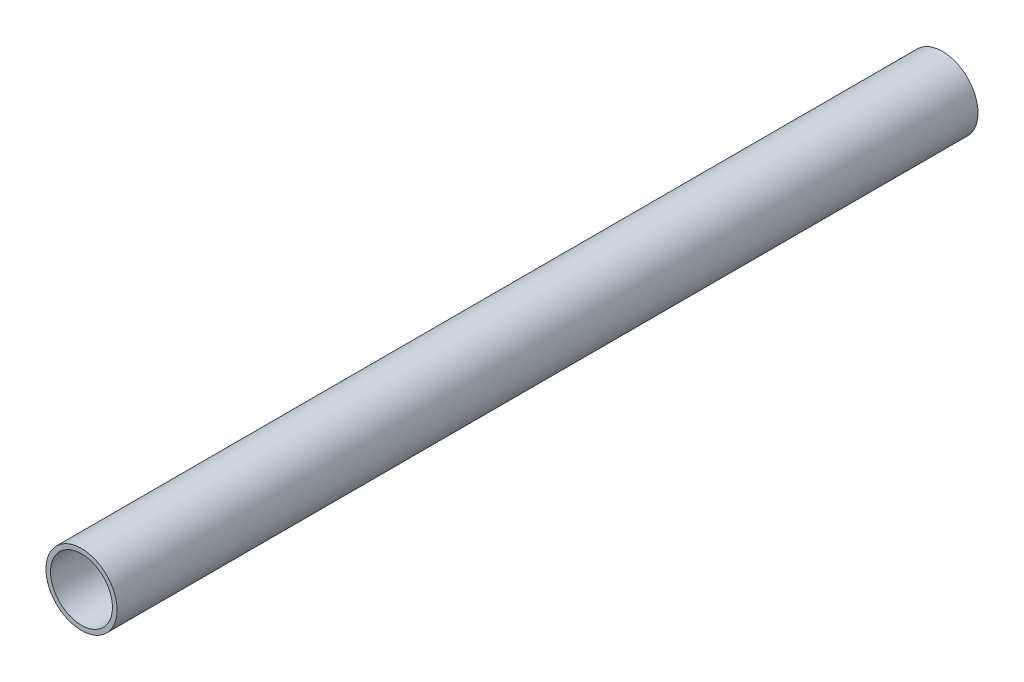
ISO-10303-21;
HEADER;
FILE_DESCRIPTION(('STEP AP214'),'2;1');
FILE_NAME('part.step','',(''),(''),'','','');
FILE_SCHEMA(('AUTOMOTIVE_DESIGN { 1 0 10303 214 1 1 1 1 }'));
ENDSEC;
DATA;
#1=APPLICATION_CONTEXT('core data for automotive mechanical design processes');
#2=APPLICATION_PROTOCOL_DEFINITION('international standard','automotive_design',2000,#1);
#3=PRODUCT_CONTEXT('',#1,'mechanical');
#4=PRODUCT('Part','Part','',(#3));
#5=PRODUCT_RELATED_PRODUCT_CATEGORY('part','',(#4));
#6=PRODUCT_DEFINITION_FORMATION('','',#4);
#7=PRODUCT_DEFINITION_CONTEXT('part definition',#1,'design');
#8=PRODUCT_DEFINITION('design','',#6,#7);
#9=PRODUCT_DEFINITION_SHAPE('','',#8);
#10=(LENGTH_UNIT() NAMED_UNIT(*) SI_UNIT(.MILLI.,.METRE.));
#11=(NAMED_UNIT(*) PLANE_ANGLE_UNIT() SI_UNIT($,.RADIAN.));
#12=(NAMED_UNIT(*) SI_UNIT($,.STERADIAN.) SOLID_ANGLE_UNIT());
#13=UNCERTAINTY_MEASURE_WITH_UNIT(LENGTH_MEASURE(1.E-05),#10,'distance_accuracy_value','');
#14=(GEOMETRIC_REPRESENTATION_CONTEXT(3) GLOBAL_UNCERTAINTY_ASSIGNED_CONTEXT((#13)) GLOBAL_UNIT_ASSIGNED_CONTEXT((#10,
#11,#12)) REPRESENTATION_CONTEXT('',''));
#15=CARTESIAN_POINT('',(0.,0.,0.));
#16=DIRECTION('',(0.,0.,1.));
#17=DIRECTION('',(1.,0.,0.));
#18=AXIS2_PLACEMENT_3D('',#15,#16,#17);
#19=CARTESIAN_POINT('',(0.,0.,730.25));
#20=DIRECTION('',(0.,0.,1.));
#21=DIRECTION('',(1.,0.,0.));
#22=AXIS2_PLACEMENT_3D('',#19,#20,#21);
#23=PLANE('',#22);
#24=CARTESIAN_POINT('',(0.,0.,730.25));
#25=DIRECTION('',(0.,0.,1.));
#26=DIRECTION('',(1.,0.,0.));
#27=AXIS2_PLACEMENT_3D('',#24,#25,#26);
#28=CIRCLE('',#27,30.1625);
#29=CARTESIAN_POINT('',(30.1625,0.,730.25));
#30=VERTEX_POINT('',#29);
#31=EDGE_CURVE('E12',#30,#30,#28,.T.);
#32=ORIENTED_EDGE('',*,*,#31,.T.);
#33=EDGE_LOOP('',(#32));
#34=FACE_BOUND('',#33,.T.);
#35=CARTESIAN_POINT('',(0.,0.,730.25));
#36=DIRECTION('',(0.,0.,1.));
#37=DIRECTION('',(1.,0.,0.));
#38=AXIS2_PLACEMENT_3D('',#35,#36,#37);
#39=CIRCLE('',#38,26.2509);
#40=CARTESIAN_POINT('',(26.2509,0.,730.25));
#41=VERTEX_POINT('',#40);
#42=EDGE_CURVE('E52',#41,#41,#39,.T.);
#43=ORIENTED_EDGE('',*,*,#42,.F.);
#44=EDGE_LOOP('',(#43));
#45=FACE_BOUND('',#44,.T.);
#46=ADVANCED_FACE('F41',(#34,#45),#23,.T.);
#47=CARTESIAN_POINT('',(0.,0.,0.));
#48=DIRECTION('',(0.,0.,1.));
#49=DIRECTION('',(1.,0.,0.));
#50=AXIS2_PLACEMENT_3D('',#47,#48,#49);
#51=PLANE('',#50);
#52=CARTESIAN_POINT('',(0.,0.,0.));
#53=DIRECTION('',(0.,0.,1.));
#54=DIRECTION('',(1.,0.,0.));
#55=AXIS2_PLACEMENT_3D('',#52,#53,#54);
#56=CIRCLE('',#55,30.1625);
#57=CARTESIAN_POINT('',(30.1625,0.,0.));
#58=VERTEX_POINT('',#57);
#59=EDGE_CURVE('E45',#58,#58,#56,.T.);
#60=ORIENTED_EDGE('',*,*,#59,.F.);
#61=EDGE_LOOP('',(#60));
#62=FACE_BOUND('',#61,.T.);
#63=CARTESIAN_POINT('',(0.,0.,0.));
#64=DIRECTION('',(0.,0.,1.));
#65=DIRECTION('',(1.,0.,0.));
#66=AXIS2_PLACEMENT_3D('',#63,#64,#65);
#67=CIRCLE('',#66,26.2509);
#68=CARTESIAN_POINT('',(26.2509,0.,0.));
#69=VERTEX_POINT('',#68);
#70=EDGE_CURVE('E54',#69,#69,#67,.T.);
#71=ORIENTED_EDGE('',*,*,#70,.T.);
#72=EDGE_LOOP('',(#71));
#73=FACE_BOUND('',#72,.T.);
#74=ADVANCED_FACE('F64',(#62,#73),#51,.F.);
#75=CARTESIAN_POINT('',(0.,0.,730.25));
#76=DIRECTION('',(0.,0.,-1.));
#77=DIRECTION('',(-1.,0.,0.));
#78=AXIS2_PLACEMENT_3D('',#75,#76,#77);
#79=CYLINDRICAL_SURFACE('',#78,30.1625);
#80=ORIENTED_EDGE('',*,*,#31,.F.);
#81=EDGE_LOOP('',(#80));
#82=FACE_BOUND('',#81,.T.);
#83=ORIENTED_EDGE('',*,*,#59,.T.);
#84=EDGE_LOOP('',(#83));
#85=FACE_BOUND('',#84,.T.);
#86=ADVANCED_FACE('F43',(#82,#85),#79,.T.);
#87=CARTESIAN_POINT('',(0.,0.,730.25));
#88=DIRECTION('',(0.,0.,-1.));
#89=DIRECTION('',(-1.,0.,0.));
#90=AXIS2_PLACEMENT_3D('',#87,#88,#89);
#91=CYLINDRICAL_SURFACE('',#90,26.2509);
#92=ORIENTED_EDGE('',*,*,#42,.T.);
#93=EDGE_LOOP('',(#92));
#94=FACE_BOUND('',#93,.T.);
#95=ORIENTED_EDGE('',*,*,#70,.F.);
#96=EDGE_LOOP('',(#95));
#97=FACE_BOUND('',#96,.T.);
#98=ADVANCED_FACE('F60',(#94,#97),#91,.F.);
#99=CLOSED_SHELL('',(#46,#74,#86,#98));
#100=MANIFOLD_SOLID_BREP('B2',#99);
#101=ADVANCED_BREP_SHAPE_REPRESENTATION('',(#18,#100),#14);
#102=SHAPE_DEFINITION_REPRESENTATION(#9,#101);
ENDSEC;
END-ISO-10303-21;
